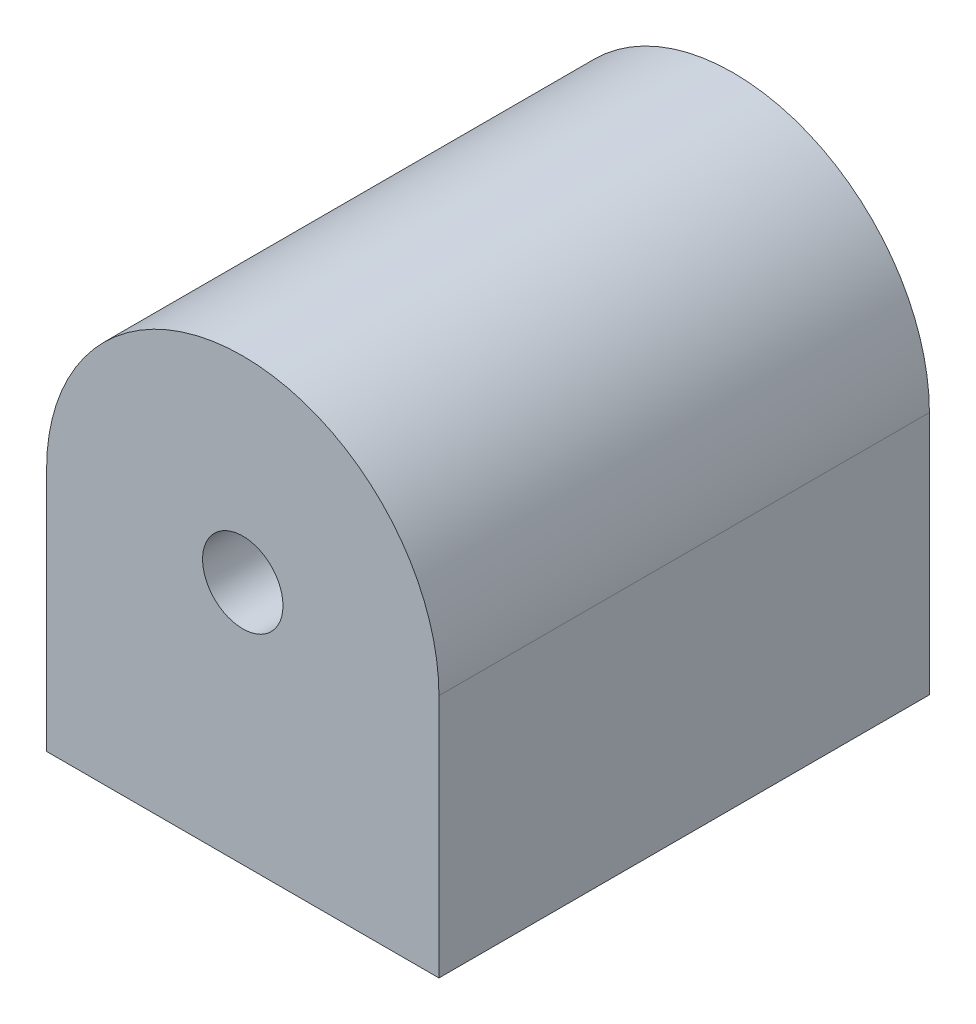
ISO-10303-21;
HEADER;
FILE_DESCRIPTION(('STEP AP214'),'2;1');
FILE_NAME('part.step','',(''),(''),'','','');
FILE_SCHEMA(('AUTOMOTIVE_DESIGN { 1 0 10303 214 1 1 1 1 }'));
ENDSEC;
DATA;
#1=APPLICATION_CONTEXT('core data for automotive mechanical design processes');
#2=APPLICATION_PROTOCOL_DEFINITION('international standard','automotive_design',2000,#1);
#3=PRODUCT_CONTEXT('',#1,'mechanical');
#4=PRODUCT('Part','Part','',(#3));
#5=PRODUCT_RELATED_PRODUCT_CATEGORY('part','',(#4));
#6=PRODUCT_DEFINITION_FORMATION('','',#4);
#7=PRODUCT_DEFINITION_CONTEXT('part definition',#1,'design');
#8=PRODUCT_DEFINITION('design','',#6,#7);
#9=PRODUCT_DEFINITION_SHAPE('','',#8);
#10=(LENGTH_UNIT() NAMED_UNIT(*) SI_UNIT(.MILLI.,.METRE.));
#11=(NAMED_UNIT(*) PLANE_ANGLE_UNIT() SI_UNIT($,.RADIAN.));
#12=(NAMED_UNIT(*) SI_UNIT($,.STERADIAN.) SOLID_ANGLE_UNIT());
#13=UNCERTAINTY_MEASURE_WITH_UNIT(LENGTH_MEASURE(1.E-05),#10,'distance_accuracy_value','');
#14=(GEOMETRIC_REPRESENTATION_CONTEXT(3) GLOBAL_UNCERTAINTY_ASSIGNED_CONTEXT((#13)) GLOBAL_UNIT_ASSIGNED_CONTEXT((#10,
#11,#12)) REPRESENTATION_CONTEXT('',''));
#15=CARTESIAN_POINT('',(0.,0.,0.));
#16=DIRECTION('',(0.,0.,1.));
#17=DIRECTION('',(1.,0.,0.));
#18=AXIS2_PLACEMENT_3D('',#15,#16,#17);
#19=CARTESIAN_POINT('',(0.,0.,50.));
#20=DIRECTION('',(0.,0.,1.));
#21=DIRECTION('',(1.,0.,0.));
#22=AXIS2_PLACEMENT_3D('',#19,#20,#21);
#23=PLANE('',#22);
#24=CARTESIAN_POINT('',(0.,0.,50.));
#25=DIRECTION('',(0.,0.,1.));
#26=DIRECTION('',(1.,0.,0.));
#27=AXIS2_PLACEMENT_3D('',#24,#25,#26);
#28=CIRCLE('',#27,40.);
#29=CARTESIAN_POINT('',(40.,0.,50.));
#30=VERTEX_POINT('',#29);
#31=CARTESIAN_POINT('',(-40.,0.,50.));
#32=VERTEX_POINT('',#31);
#33=EDGE_CURVE('E85',#30,#32,#28,.T.);
#34=ORIENTED_EDGE('',*,*,#33,.T.);
#35=DIRECTION('',(0.,-1.,0.));
#36=VECTOR('',#35,1.);
#37=CARTESIAN_POINT('',(-40.,0.,50.));
#38=LINE('',#37,#36);
#39=CARTESIAN_POINT('',(-40.,-49.8471776305092,50.));
#40=VERTEX_POINT('',#39);
#41=EDGE_CURVE('E80',#32,#40,#38,.T.);
#42=ORIENTED_EDGE('',*,*,#41,.T.);
#43=DIRECTION('',(1.,0.,0.));
#44=VECTOR('',#43,1.);
#45=CARTESIAN_POINT('',(-40.,-49.8471776305092,50.));
#46=LINE('',#45,#44);
#47=CARTESIAN_POINT('',(40.,-49.8471776305092,50.));
#48=VERTEX_POINT('',#47);
#49=EDGE_CURVE('E83',#40,#48,#46,.T.);
#50=ORIENTED_EDGE('',*,*,#49,.T.);
#51=DIRECTION('',(0.,1.,0.));
#52=VECTOR('',#51,1.);
#53=CARTESIAN_POINT('',(40.,0.,50.));
#54=LINE('',#53,#52);
#55=EDGE_CURVE('E50',#48,#30,#54,.T.);
#56=ORIENTED_EDGE('',*,*,#55,.T.);
#57=EDGE_LOOP('',(#34,#42,#50,#56));
#58=FACE_BOUND('',#57,.T.);
#59=CARTESIAN_POINT('',(0.,0.,50.));
#60=DIRECTION('',(0.,0.,1.));
#61=DIRECTION('',(1.,0.,0.));
#62=AXIS2_PLACEMENT_3D('',#59,#60,#61);
#63=CIRCLE('',#62,8.19547162491472);
#64=CARTESIAN_POINT('',(8.19547162491472,0.,50.));
#65=VERTEX_POINT('',#64);
#66=EDGE_CURVE('E100',#65,#65,#63,.T.);
#67=ORIENTED_EDGE('',*,*,#66,.F.);
#68=EDGE_LOOP('',(#67));
#69=FACE_BOUND('',#68,.T.);
#70=ADVANCED_FACE('F33',(#58,#69),#23,.T.);
#71=CARTESIAN_POINT('',(0.,0.,-50.));
#72=DIRECTION('',(0.,0.,1.));
#73=DIRECTION('',(1.,0.,0.));
#74=AXIS2_PLACEMENT_3D('',#71,#72,#73);
#75=PLANE('',#74);
#76=CARTESIAN_POINT('',(0.,0.,-50.));
#77=DIRECTION('',(0.,0.,1.));
#78=DIRECTION('',(1.,0.,0.));
#79=AXIS2_PLACEMENT_3D('',#76,#77,#78);
#80=CIRCLE('',#79,40.);
#81=CARTESIAN_POINT('',(40.,0.,-50.));
#82=VERTEX_POINT('',#81);
#83=CARTESIAN_POINT('',(-40.,0.,-50.));
#84=VERTEX_POINT('',#83);
#85=EDGE_CURVE('E97',#82,#84,#80,.T.);
#86=ORIENTED_EDGE('',*,*,#85,.F.);
#87=DIRECTION('',(0.,1.,0.));
#88=VECTOR('',#87,1.);
#89=CARTESIAN_POINT('',(40.,0.,-50.));
#90=LINE('',#89,#88);
#91=CARTESIAN_POINT('',(40.,-49.8471776305092,-50.));
#92=VERTEX_POINT('',#91);
#93=EDGE_CURVE('E73',#92,#82,#90,.T.);
#94=ORIENTED_EDGE('',*,*,#93,.F.);
#95=DIRECTION('',(1.,0.,0.));
#96=VECTOR('',#95,1.);
#97=CARTESIAN_POINT('',(-40.,-49.8471776305092,-50.));
#98=LINE('',#97,#96);
#99=CARTESIAN_POINT('',(-40.,-49.8471776305092,-50.));
#100=VERTEX_POINT('',#99);
#101=EDGE_CURVE('E67',#100,#92,#98,.T.);
#102=ORIENTED_EDGE('',*,*,#101,.F.);
#103=DIRECTION('',(0.,-1.,0.));
#104=VECTOR('',#103,1.);
#105=CARTESIAN_POINT('',(-40.,0.,-50.));
#106=LINE('',#105,#104);
#107=EDGE_CURVE('E89',#84,#100,#106,.T.);
#108=ORIENTED_EDGE('',*,*,#107,.F.);
#109=EDGE_LOOP('',(#86,#94,#102,#108));
#110=FACE_BOUND('',#109,.T.);
#111=CARTESIAN_POINT('',(0.,0.,-50.));
#112=DIRECTION('',(0.,0.,1.));
#113=DIRECTION('',(1.,0.,0.));
#114=AXIS2_PLACEMENT_3D('',#111,#112,#113);
#115=CIRCLE('',#114,8.19547162491472);
#116=CARTESIAN_POINT('',(8.19547162491472,0.,-50.));
#117=VERTEX_POINT('',#116);
#118=EDGE_CURVE('E112',#117,#117,#115,.T.);
#119=ORIENTED_EDGE('',*,*,#118,.T.);
#120=EDGE_LOOP('',(#119));
#121=FACE_BOUND('',#120,.T.);
#122=ADVANCED_FACE('F108',(#110,#121),#75,.F.);
#123=CARTESIAN_POINT('',(0.,0.,50.));
#124=DIRECTION('',(0.,0.,-1.));
#125=DIRECTION('',(-1.,0.,0.));
#126=AXIS2_PLACEMENT_3D('',#123,#124,#125);
#127=CYLINDRICAL_SURFACE('',#126,40.);
#128=ORIENTED_EDGE('',*,*,#85,.T.);
#129=DIRECTION('',(0.,0.,-1.));
#130=VECTOR('',#129,1.);
#131=CARTESIAN_POINT('',(-40.,0.,50.));
#132=LINE('',#131,#130);
#133=EDGE_CURVE('E11',#32,#84,#132,.T.);
#134=ORIENTED_EDGE('',*,*,#133,.F.);
#135=ORIENTED_EDGE('',*,*,#33,.F.);
#136=DIRECTION('',(0.,0.,-1.));
#137=VECTOR('',#136,1.);
#138=CARTESIAN_POINT('',(40.,0.,50.));
#139=LINE('',#138,#137);
#140=EDGE_CURVE('E93',#30,#82,#139,.T.);
#141=ORIENTED_EDGE('',*,*,#140,.T.);
#142=EDGE_LOOP('',(#128,#134,#135,#141));
#143=FACE_BOUND('',#142,.T.);
#144=ADVANCED_FACE('F35',(#143),#127,.T.);
#145=CARTESIAN_POINT('',(-40.,0.,50.));
#146=DIRECTION('',(1.,0.,0.));
#147=DIRECTION('',(0.,0.,-1.));
#148=AXIS2_PLACEMENT_3D('',#145,#146,#147);
#149=PLANE('',#148);
#150=ORIENTED_EDGE('',*,*,#107,.T.);
#151=DIRECTION('',(0.,0.,-1.));
#152=VECTOR('',#151,1.);
#153=CARTESIAN_POINT('',(-40.,-49.8471776305092,50.));
#154=LINE('',#153,#152);
#155=EDGE_CURVE('E42',#40,#100,#154,.T.);
#156=ORIENTED_EDGE('',*,*,#155,.F.);
#157=ORIENTED_EDGE('',*,*,#41,.F.);
#158=ORIENTED_EDGE('',*,*,#133,.T.);
#159=EDGE_LOOP('',(#150,#156,#157,#158));
#160=FACE_BOUND('',#159,.T.);
#161=ADVANCED_FACE('F88',(#160),#149,.F.);
#162=CARTESIAN_POINT('',(-40.,-49.8471776305092,50.));
#163=DIRECTION('',(0.,1.,0.));
#164=DIRECTION('',(0.,0.,1.));
#165=AXIS2_PLACEMENT_3D('',#162,#163,#164);
#166=PLANE('',#165);
#167=ORIENTED_EDGE('',*,*,#101,.T.);
#168=DIRECTION('',(0.,0.,-1.));
#169=VECTOR('',#168,1.);
#170=CARTESIAN_POINT('',(40.,-49.8471776305092,50.));
#171=LINE('',#170,#169);
#172=EDGE_CURVE('E90',#48,#92,#171,.T.);
#173=ORIENTED_EDGE('',*,*,#172,.F.);
#174=ORIENTED_EDGE('',*,*,#49,.F.);
#175=ORIENTED_EDGE('',*,*,#155,.T.);
#176=EDGE_LOOP('',(#167,#173,#174,#175));
#177=FACE_BOUND('',#176,.T.);
#178=ADVANCED_FACE('F91',(#177),#166,.F.);
#179=CARTESIAN_POINT('',(40.,0.,50.));
#180=DIRECTION('',(-1.,0.,0.));
#181=DIRECTION('',(0.,0.,1.));
#182=AXIS2_PLACEMENT_3D('',#179,#180,#181);
#183=PLANE('',#182);
#184=ORIENTED_EDGE('',*,*,#93,.T.);
#185=ORIENTED_EDGE('',*,*,#140,.F.);
#186=ORIENTED_EDGE('',*,*,#55,.F.);
#187=ORIENTED_EDGE('',*,*,#172,.T.);
#188=EDGE_LOOP('',(#184,#185,#186,#187));
#189=FACE_BOUND('',#188,.T.);
#190=ADVANCED_FACE('F105',(#189),#183,.F.);
#191=CARTESIAN_POINT('',(0.,0.,50.));
#192=DIRECTION('',(0.,0.,-1.));
#193=DIRECTION('',(-1.,0.,0.));
#194=AXIS2_PLACEMENT_3D('',#191,#192,#193);
#195=CYLINDRICAL_SURFACE('',#194,8.19547162491472);
#196=ORIENTED_EDGE('',*,*,#66,.T.);
#197=EDGE_LOOP('',(#196));
#198=FACE_BOUND('',#197,.T.);
#199=ORIENTED_EDGE('',*,*,#118,.F.);
#200=EDGE_LOOP('',(#199));
#201=FACE_BOUND('',#200,.T.);
#202=ADVANCED_FACE('F118',(#198,#201),#195,.F.);
#203=CLOSED_SHELL('',(#70,#122,#144,#161,#178,#190,#202));
#204=MANIFOLD_SOLID_BREP('B2',#203);
#205=ADVANCED_BREP_SHAPE_REPRESENTATION('',(#18,#204),#14);
#206=SHAPE_DEFINITION_REPRESENTATION(#9,#205);
ENDSEC;
END-ISO-10303-21;
